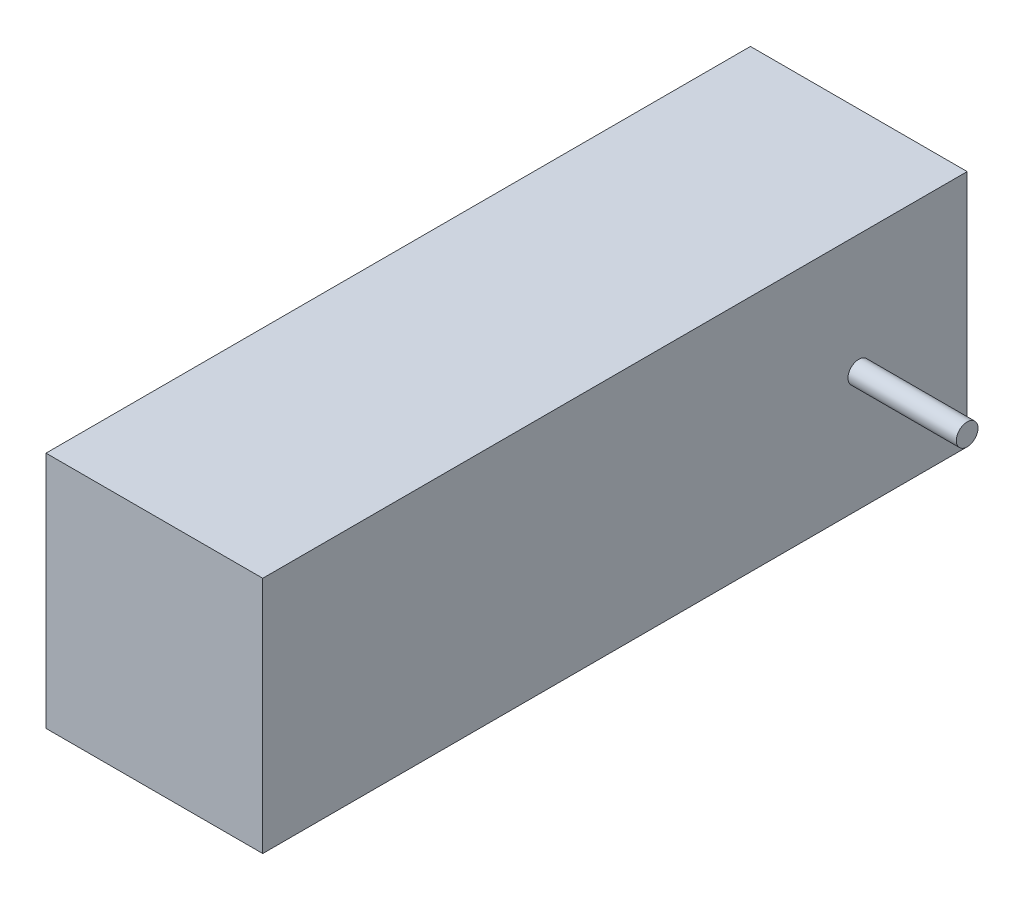
ISO-10303-21;
HEADER;
FILE_DESCRIPTION(('STEP AP214'),'2;1');
FILE_NAME('part.step','',(''),(''),'','','');
FILE_SCHEMA(('AUTOMOTIVE_DESIGN { 1 0 10303 214 1 1 1 1 }'));
ENDSEC;
DATA;
#1=APPLICATION_CONTEXT('core data for automotive mechanical design processes');
#2=APPLICATION_PROTOCOL_DEFINITION('international standard','automotive_design',2000,#1);
#3=PRODUCT_CONTEXT('',#1,'mechanical');
#4=PRODUCT('Part','Part','',(#3));
#5=PRODUCT_RELATED_PRODUCT_CATEGORY('part','',(#4));
#6=PRODUCT_DEFINITION_FORMATION('','',#4);
#7=PRODUCT_DEFINITION_CONTEXT('part definition',#1,'design');
#8=PRODUCT_DEFINITION('design','',#6,#7);
#9=PRODUCT_DEFINITION_SHAPE('','',#8);
#10=(LENGTH_UNIT() NAMED_UNIT(*) SI_UNIT(.MILLI.,.METRE.));
#11=(NAMED_UNIT(*) PLANE_ANGLE_UNIT() SI_UNIT($,.RADIAN.));
#12=(NAMED_UNIT(*) SI_UNIT($,.STERADIAN.) SOLID_ANGLE_UNIT());
#13=UNCERTAINTY_MEASURE_WITH_UNIT(LENGTH_MEASURE(1.E-05),#10,'distance_accuracy_value','');
#14=(GEOMETRIC_REPRESENTATION_CONTEXT(3) GLOBAL_UNCERTAINTY_ASSIGNED_CONTEXT((#13)) GLOBAL_UNIT_ASSIGNED_CONTEXT((#10,
#11,#12)) REPRESENTATION_CONTEXT('',''));
#15=CARTESIAN_POINT('',(0.,0.,0.));
#16=DIRECTION('',(0.,0.,1.));
#17=DIRECTION('',(1.,0.,0.));
#18=AXIS2_PLACEMENT_3D('',#15,#16,#17);
#19=CARTESIAN_POINT('',(-10.,11.,65.));
#20=DIRECTION('',(1.,0.,0.));
#21=DIRECTION('',(0.,1.,0.));
#22=AXIS2_PLACEMENT_3D('',#19,#20,#21);
#23=PLANE('',#22);
#24=CARTESIAN_POINT('',(-10.,0.,10.));
#25=DIRECTION('',(1.,0.,0.));
#26=DIRECTION('',(0.,1.,0.));
#27=AXIS2_PLACEMENT_3D('',#24,#25,#26);
#28=CIRCLE('',#27,1.);
#29=CARTESIAN_POINT('',(-10.,0.999999999999998,10.));
#30=VERTEX_POINT('',#29);
#31=EDGE_CURVE('E103',#30,#30,#28,.T.);
#32=ORIENTED_EDGE('',*,*,#31,.T.);
#33=EDGE_LOOP('',(#32));
#34=FACE_BOUND('',#33,.T.);
#35=DIRECTION('',(0.,-1.,0.));
#36=VECTOR('',#35,1.);
#37=CARTESIAN_POINT('',(-10.,11.,0.));
#38=LINE('',#37,#36);
#39=CARTESIAN_POINT('',(-10.,11.,0.));
#40=VERTEX_POINT('',#39);
#41=CARTESIAN_POINT('',(-10.,-11.,0.));
#42=VERTEX_POINT('',#41);
#43=EDGE_CURVE('E100',#40,#42,#38,.T.);
#44=ORIENTED_EDGE('',*,*,#43,.T.);
#45=DIRECTION('',(0.,0.,-1.));
#46=VECTOR('',#45,1.);
#47=CARTESIAN_POINT('',(-10.,-11.,65.));
#48=LINE('',#47,#46);
#49=CARTESIAN_POINT('',(-10.,-11.,65.));
#50=VERTEX_POINT('',#49);
#51=EDGE_CURVE('E11',#50,#42,#48,.T.);
#52=ORIENTED_EDGE('',*,*,#51,.F.);
#53=DIRECTION('',(0.,-1.,0.));
#54=VECTOR('',#53,1.);
#55=CARTESIAN_POINT('',(-10.,11.,65.));
#56=LINE('',#55,#54);
#57=CARTESIAN_POINT('',(-10.,11.,65.));
#58=VERTEX_POINT('',#57);
#59=EDGE_CURVE('E87',#58,#50,#56,.T.);
#60=ORIENTED_EDGE('',*,*,#59,.F.);
#61=DIRECTION('',(0.,0.,-1.));
#62=VECTOR('',#61,1.);
#63=CARTESIAN_POINT('',(-10.,11.,65.));
#64=LINE('',#63,#62);
#65=EDGE_CURVE('E96',#58,#40,#64,.T.);
#66=ORIENTED_EDGE('',*,*,#65,.T.);
#67=EDGE_LOOP('',(#44,#52,#60,#66));
#68=FACE_BOUND('',#67,.T.);
#69=ADVANCED_FACE('F35',(#34,#68),#23,.F.);
#70=CARTESIAN_POINT('',(10.,-11.,65.));
#71=DIRECTION('',(0.,1.,0.));
#72=DIRECTION('',(-1.,0.,0.));
#73=AXIS2_PLACEMENT_3D('',#70,#71,#72);
#74=PLANE('',#73);
#75=DIRECTION('',(1.,0.,0.));
#76=VECTOR('',#75,1.);
#77=CARTESIAN_POINT('',(10.,-11.,0.));
#78=LINE('',#77,#76);
#79=CARTESIAN_POINT('',(10.,-11.,0.));
#80=VERTEX_POINT('',#79);
#81=EDGE_CURVE('E91',#42,#80,#78,.T.);
#82=ORIENTED_EDGE('',*,*,#81,.T.);
#83=DIRECTION('',(0.,0.,-1.));
#84=VECTOR('',#83,1.);
#85=CARTESIAN_POINT('',(10.,-11.,65.));
#86=LINE('',#85,#84);
#87=CARTESIAN_POINT('',(10.,-11.,65.));
#88=VERTEX_POINT('',#87);
#89=EDGE_CURVE('E44',#88,#80,#86,.T.);
#90=ORIENTED_EDGE('',*,*,#89,.F.);
#91=DIRECTION('',(1.,0.,0.));
#92=VECTOR('',#91,1.);
#93=CARTESIAN_POINT('',(10.,-11.,65.));
#94=LINE('',#93,#92);
#95=EDGE_CURVE('E82',#50,#88,#94,.T.);
#96=ORIENTED_EDGE('',*,*,#95,.F.);
#97=ORIENTED_EDGE('',*,*,#51,.T.);
#98=EDGE_LOOP('',(#82,#90,#96,#97));
#99=FACE_BOUND('',#98,.T.);
#100=ADVANCED_FACE('F90',(#99),#74,.F.);
#101=CARTESIAN_POINT('',(10.,11.,65.));
#102=DIRECTION('',(-1.,0.,0.));
#103=DIRECTION('',(0.,-1.,0.));
#104=AXIS2_PLACEMENT_3D('',#101,#102,#103);
#105=PLANE('',#104);
#106=CARTESIAN_POINT('',(10.,0.,10.));
#107=DIRECTION('',(-1.,0.,0.));
#108=DIRECTION('',(0.,-1.,0.));
#109=AXIS2_PLACEMENT_3D('',#106,#107,#108);
#110=CIRCLE('',#109,1.);
#111=CARTESIAN_POINT('',(10.,-0.999999999999998,10.));
#112=VERTEX_POINT('',#111);
#113=EDGE_CURVE('E38',#112,#112,#110,.T.);
#114=ORIENTED_EDGE('',*,*,#113,.T.);
#115=EDGE_LOOP('',(#114));
#116=FACE_BOUND('',#115,.T.);
#117=DIRECTION('',(0.,1.,0.));
#118=VECTOR('',#117,1.);
#119=CARTESIAN_POINT('',(10.,11.,0.));
#120=LINE('',#119,#118);
#121=CARTESIAN_POINT('',(10.,11.,0.));
#122=VERTEX_POINT('',#121);
#123=EDGE_CURVE('E69',#80,#122,#120,.T.);
#124=ORIENTED_EDGE('',*,*,#123,.T.);
#125=DIRECTION('',(0.,0.,-1.));
#126=VECTOR('',#125,1.);
#127=CARTESIAN_POINT('',(10.,11.,65.));
#128=LINE('',#127,#126);
#129=CARTESIAN_POINT('',(10.,11.,65.));
#130=VERTEX_POINT('',#129);
#131=EDGE_CURVE('E92',#130,#122,#128,.T.);
#132=ORIENTED_EDGE('',*,*,#131,.F.);
#133=DIRECTION('',(0.,1.,0.));
#134=VECTOR('',#133,1.);
#135=CARTESIAN_POINT('',(10.,11.,65.));
#136=LINE('',#135,#134);
#137=EDGE_CURVE('E85',#88,#130,#136,.T.);
#138=ORIENTED_EDGE('',*,*,#137,.F.);
#139=ORIENTED_EDGE('',*,*,#89,.T.);
#140=EDGE_LOOP('',(#124,#132,#138,#139));
#141=FACE_BOUND('',#140,.T.);
#142=ADVANCED_FACE('F94',(#116,#141),#105,.F.);
#143=CARTESIAN_POINT('',(10.,11.,65.));
#144=DIRECTION('',(0.,-1.,0.));
#145=DIRECTION('',(1.,0.,0.));
#146=AXIS2_PLACEMENT_3D('',#143,#144,#145);
#147=PLANE('',#146);
#148=DIRECTION('',(-1.,0.,0.));
#149=VECTOR('',#148,1.);
#150=CARTESIAN_POINT('',(10.,11.,0.));
#151=LINE('',#150,#149);
#152=EDGE_CURVE('E75',#122,#40,#151,.T.);
#153=ORIENTED_EDGE('',*,*,#152,.T.);
#154=ORIENTED_EDGE('',*,*,#65,.F.);
#155=DIRECTION('',(-1.,0.,0.));
#156=VECTOR('',#155,1.);
#157=CARTESIAN_POINT('',(10.,11.,65.));
#158=LINE('',#157,#156);
#159=EDGE_CURVE('E52',#130,#58,#158,.T.);
#160=ORIENTED_EDGE('',*,*,#159,.F.);
#161=ORIENTED_EDGE('',*,*,#131,.T.);
#162=EDGE_LOOP('',(#153,#154,#160,#161));
#163=FACE_BOUND('',#162,.T.);
#164=ADVANCED_FACE('F108',(#163),#147,.F.);
#165=CARTESIAN_POINT('',(0.,0.,65.));
#166=DIRECTION('',(0.,0.,-1.));
#167=DIRECTION('',(-1.,0.,0.));
#168=AXIS2_PLACEMENT_3D('',#165,#166,#167);
#169=PLANE('',#168);
#170=ORIENTED_EDGE('',*,*,#59,.T.);
#171=ORIENTED_EDGE('',*,*,#95,.T.);
#172=ORIENTED_EDGE('',*,*,#137,.T.);
#173=ORIENTED_EDGE('',*,*,#159,.T.);
#174=EDGE_LOOP('',(#170,#171,#172,#173));
#175=FACE_BOUND('',#174,.T.);
#176=ADVANCED_FACE('F83',(#175),#169,.F.);
#177=CARTESIAN_POINT('',(0.,0.,0.));
#178=DIRECTION('',(0.,0.,-1.));
#179=DIRECTION('',(-1.,0.,0.));
#180=AXIS2_PLACEMENT_3D('',#177,#178,#179);
#181=PLANE('',#180);
#182=ORIENTED_EDGE('',*,*,#43,.F.);
#183=ORIENTED_EDGE('',*,*,#152,.F.);
#184=ORIENTED_EDGE('',*,*,#123,.F.);
#185=ORIENTED_EDGE('',*,*,#81,.F.);
#186=EDGE_LOOP('',(#182,#183,#184,#185));
#187=FACE_BOUND('',#186,.T.);
#188=ADVANCED_FACE('F111',(#187),#181,.T.);
#189=CARTESIAN_POINT('',(20.,0.,10.));
#190=DIRECTION('',(1.,0.,0.));
#191=DIRECTION('',(0.,1.,0.));
#192=AXIS2_PLACEMENT_3D('',#189,#190,#191);
#193=PLANE('',#192);
#194=CARTESIAN_POINT('',(20.,0.,10.));
#195=DIRECTION('',(1.,0.,0.));
#196=DIRECTION('',(0.,1.,0.));
#197=AXIS2_PLACEMENT_3D('',#194,#195,#196);
#198=CIRCLE('',#197,1.);
#199=CARTESIAN_POINT('',(20.,1.,10.));
#200=VERTEX_POINT('',#199);
#201=EDGE_CURVE('E119',#200,#200,#198,.T.);
#202=ORIENTED_EDGE('',*,*,#201,.T.);
#203=EDGE_LOOP('',(#202));
#204=FACE_BOUND('',#203,.T.);
#205=ADVANCED_FACE('F123',(#204),#193,.T.);
#206=CARTESIAN_POINT('',(-18.,0.,10.));
#207=DIRECTION('',(1.,0.,0.));
#208=DIRECTION('',(0.,1.,0.));
#209=AXIS2_PLACEMENT_3D('',#206,#207,#208);
#210=CYLINDRICAL_SURFACE('',#209,1.);
#211=ORIENTED_EDGE('',*,*,#201,.F.);
#212=EDGE_LOOP('',(#211));
#213=FACE_BOUND('',#212,.T.);
#214=ORIENTED_EDGE('',*,*,#113,.F.);
#215=EDGE_LOOP('',(#214));
#216=FACE_BOUND('',#215,.T.);
#217=ADVANCED_FACE('F125',(#213,#216),#210,.T.);
#218=CARTESIAN_POINT('',(-18.,0.,10.));
#219=DIRECTION('',(1.,0.,0.));
#220=DIRECTION('',(0.,1.,0.));
#221=AXIS2_PLACEMENT_3D('',#218,#219,#220);
#222=CIRCLE('',#221,1.);
#223=CARTESIAN_POINT('',(-18.,0.999999999999997,10.));
#224=VERTEX_POINT('',#223);
#225=EDGE_CURVE('E116',#224,#224,#222,.T.);
#226=ORIENTED_EDGE('',*,*,#225,.T.);
#227=EDGE_LOOP('',(#226));
#228=FACE_BOUND('',#227,.T.);
#229=ORIENTED_EDGE('',*,*,#31,.F.);
#230=EDGE_LOOP('',(#229));
#231=FACE_BOUND('',#230,.T.);
#232=ADVANCED_FACE('F128',(#228,#231),#210,.T.);
#233=CARTESIAN_POINT('',(-18.,0.,10.));
#234=DIRECTION('',(1.,0.,0.));
#235=DIRECTION('',(0.,1.,0.));
#236=AXIS2_PLACEMENT_3D('',#233,#234,#235);
#237=PLANE('',#236);
#238=ORIENTED_EDGE('',*,*,#225,.F.);
#239=EDGE_LOOP('',(#238));
#240=FACE_BOUND('',#239,.T.);
#241=ADVANCED_FACE('F147',(#240),#237,.F.);
#242=CLOSED_SHELL('',(#69,#100,#142,#164,#176,#188,#205,#217,#232,#241));
#243=MANIFOLD_SOLID_BREP('B2',#242);
#244=ADVANCED_BREP_SHAPE_REPRESENTATION('',(#18,#243),#14);
#245=SHAPE_DEFINITION_REPRESENTATION(#9,#244);
ENDSEC;
END-ISO-10303-21;
